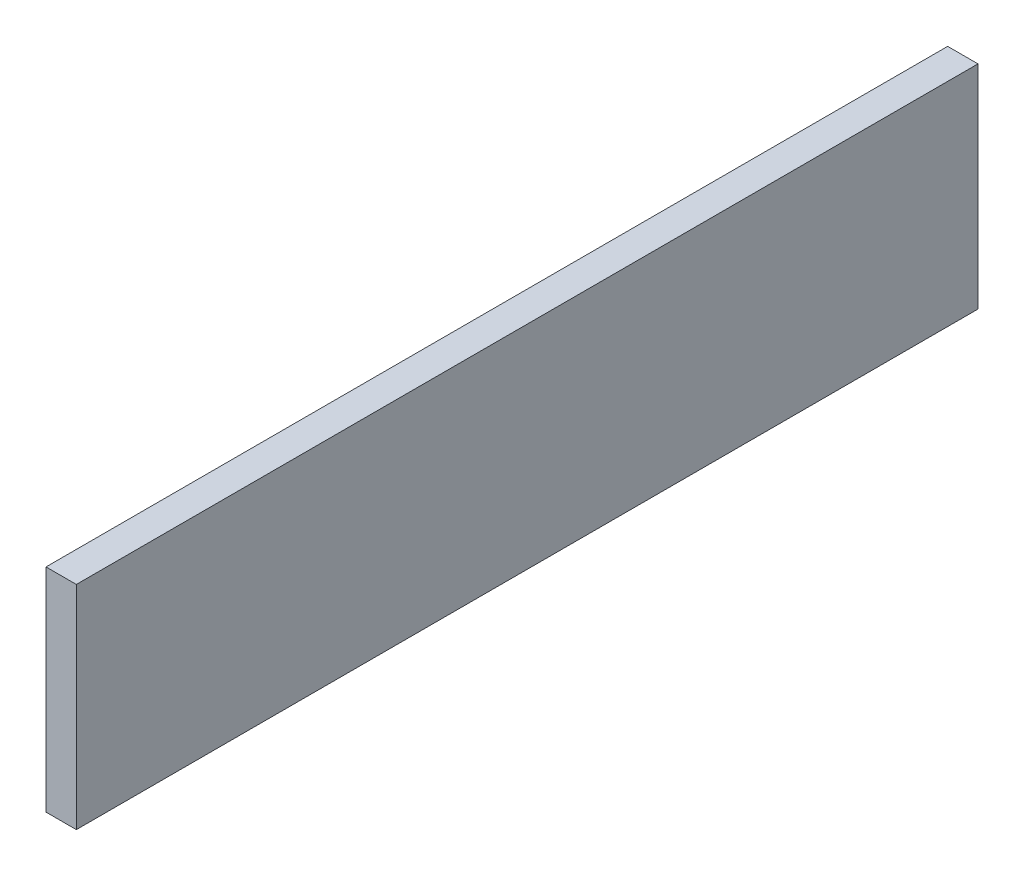
ISO-10303-21;
HEADER;
FILE_DESCRIPTION(('STEP AP214'),'2;1');
FILE_NAME('part.step','',(''),(''),'','','');
FILE_SCHEMA(('AUTOMOTIVE_DESIGN { 1 0 10303 214 1 1 1 1 }'));
ENDSEC;
DATA;
#1=APPLICATION_CONTEXT('core data for automotive mechanical design processes');
#2=APPLICATION_PROTOCOL_DEFINITION('international standard','automotive_design',2000,#1);
#3=PRODUCT_CONTEXT('',#1,'mechanical');
#4=PRODUCT('Part','Part','',(#3));
#5=PRODUCT_RELATED_PRODUCT_CATEGORY('part','',(#4));
#6=PRODUCT_DEFINITION_FORMATION('','',#4);
#7=PRODUCT_DEFINITION_CONTEXT('part definition',#1,'design');
#8=PRODUCT_DEFINITION('design','',#6,#7);
#9=PRODUCT_DEFINITION_SHAPE('','',#8);
#10=(LENGTH_UNIT() NAMED_UNIT(*) SI_UNIT(.MILLI.,.METRE.));
#11=(NAMED_UNIT(*) PLANE_ANGLE_UNIT() SI_UNIT($,.RADIAN.));
#12=(NAMED_UNIT(*) SI_UNIT($,.STERADIAN.) SOLID_ANGLE_UNIT());
#13=UNCERTAINTY_MEASURE_WITH_UNIT(LENGTH_MEASURE(1.E-05),#10,'distance_accuracy_value','');
#14=(GEOMETRIC_REPRESENTATION_CONTEXT(3) GLOBAL_UNCERTAINTY_ASSIGNED_CONTEXT((#13)) GLOBAL_UNIT_ASSIGNED_CONTEXT((#10,
#11,#12)) REPRESENTATION_CONTEXT('',''));
#15=CARTESIAN_POINT('',(0.,0.,0.));
#16=DIRECTION('',(0.,0.,1.));
#17=DIRECTION('',(1.,0.,0.));
#18=AXIS2_PLACEMENT_3D('',#15,#16,#17);
#19=CARTESIAN_POINT('',(-2.,-14.,-59.44));
#20=DIRECTION('',(-1.,0.,0.));
#21=DIRECTION('',(0.,-1.,0.));
#22=AXIS2_PLACEMENT_3D('',#19,#20,#21);
#23=PLANE('',#22);
#24=DIRECTION('',(0.,0.,1.));
#25=VECTOR('',#24,1.);
#26=CARTESIAN_POINT('',(-2.,-14.,-59.44));
#27=LINE('',#26,#25);
#28=CARTESIAN_POINT('',(-2.,-14.,-59.44));
#29=VERTEX_POINT('',#28);
#30=CARTESIAN_POINT('',(-2.,-14.,59.44));
#31=VERTEX_POINT('',#30);
#32=EDGE_CURVE('E35',#29,#31,#27,.T.);
#33=ORIENTED_EDGE('',*,*,#32,.T.);
#34=DIRECTION('',(0.,-1.,0.));
#35=VECTOR('',#34,1.);
#36=CARTESIAN_POINT('',(-2.,-14.,59.44));
#37=LINE('',#36,#35);
#38=CARTESIAN_POINT('',(-2.,14.,59.44));
#39=VERTEX_POINT('',#38);
#40=EDGE_CURVE('E72',#39,#31,#37,.T.);
#41=ORIENTED_EDGE('',*,*,#40,.F.);
#42=DIRECTION('',(0.,0.,1.));
#43=VECTOR('',#42,1.);
#44=CARTESIAN_POINT('',(-2.,14.,-59.44));
#45=LINE('',#44,#43);
#46=CARTESIAN_POINT('',(-2.,14.,-59.44));
#47=VERTEX_POINT('',#46);
#48=EDGE_CURVE('E11',#47,#39,#45,.T.);
#49=ORIENTED_EDGE('',*,*,#48,.F.);
#50=DIRECTION('',(0.,-1.,0.));
#51=VECTOR('',#50,1.);
#52=CARTESIAN_POINT('',(-2.,-14.,-59.44));
#53=LINE('',#52,#51);
#54=EDGE_CURVE('E73',#47,#29,#53,.T.);
#55=ORIENTED_EDGE('',*,*,#54,.T.);
#56=EDGE_LOOP('',(#33,#41,#49,#55));
#57=FACE_BOUND('',#56,.T.);
#58=ADVANCED_FACE('F32',(#57),#23,.T.);
#59=CARTESIAN_POINT('',(-2.,14.,-59.44));
#60=DIRECTION('',(0.,1.,0.));
#61=DIRECTION('',(0.,0.,1.));
#62=AXIS2_PLACEMENT_3D('',#59,#60,#61);
#63=PLANE('',#62);
#64=ORIENTED_EDGE('',*,*,#48,.T.);
#65=DIRECTION('',(-1.,0.,0.));
#66=VECTOR('',#65,1.);
#67=CARTESIAN_POINT('',(-2.,14.,59.44));
#68=LINE('',#67,#66);
#69=CARTESIAN_POINT('',(2.,14.,59.44));
#70=VERTEX_POINT('',#69);
#71=EDGE_CURVE('E89',#70,#39,#68,.T.);
#72=ORIENTED_EDGE('',*,*,#71,.F.);
#73=DIRECTION('',(0.,0.,1.));
#74=VECTOR('',#73,1.);
#75=CARTESIAN_POINT('',(2.,14.,-59.44));
#76=LINE('',#75,#74);
#77=CARTESIAN_POINT('',(2.,14.,-59.44));
#78=VERTEX_POINT('',#77);
#79=EDGE_CURVE('E40',#78,#70,#76,.T.);
#80=ORIENTED_EDGE('',*,*,#79,.F.);
#81=DIRECTION('',(-1.,0.,0.));
#82=VECTOR('',#81,1.);
#83=CARTESIAN_POINT('',(-2.,14.,-59.44));
#84=LINE('',#83,#82);
#85=EDGE_CURVE('E78',#78,#47,#84,.T.);
#86=ORIENTED_EDGE('',*,*,#85,.T.);
#87=EDGE_LOOP('',(#64,#72,#80,#86));
#88=FACE_BOUND('',#87,.T.);
#89=ADVANCED_FACE('F104',(#88),#63,.T.);
#90=CARTESIAN_POINT('',(2.,-14.,-59.44));
#91=DIRECTION('',(1.,0.,0.));
#92=DIRECTION('',(0.,1.,0.));
#93=AXIS2_PLACEMENT_3D('',#90,#91,#92);
#94=PLANE('',#93);
#95=ORIENTED_EDGE('',*,*,#79,.T.);
#96=DIRECTION('',(0.,1.,0.));
#97=VECTOR('',#96,1.);
#98=CARTESIAN_POINT('',(2.,-14.,59.44));
#99=LINE('',#98,#97);
#100=CARTESIAN_POINT('',(2.,-14.,59.44));
#101=VERTEX_POINT('',#100);
#102=EDGE_CURVE('E85',#101,#70,#99,.T.);
#103=ORIENTED_EDGE('',*,*,#102,.F.);
#104=DIRECTION('',(0.,0.,1.));
#105=VECTOR('',#104,1.);
#106=CARTESIAN_POINT('',(2.,-14.,-59.44));
#107=LINE('',#106,#105);
#108=CARTESIAN_POINT('',(2.,-14.,-59.44));
#109=VERTEX_POINT('',#108);
#110=EDGE_CURVE('E77',#109,#101,#107,.T.);
#111=ORIENTED_EDGE('',*,*,#110,.F.);
#112=DIRECTION('',(0.,1.,0.));
#113=VECTOR('',#112,1.);
#114=CARTESIAN_POINT('',(2.,-14.,-59.44));
#115=LINE('',#114,#113);
#116=EDGE_CURVE('E97',#109,#78,#115,.T.);
#117=ORIENTED_EDGE('',*,*,#116,.T.);
#118=EDGE_LOOP('',(#95,#103,#111,#117));
#119=FACE_BOUND('',#118,.T.);
#120=ADVANCED_FACE('F101',(#119),#94,.T.);
#121=CARTESIAN_POINT('',(-2.,-14.,-59.44));
#122=DIRECTION('',(0.,-1.,0.));
#123=DIRECTION('',(0.,0.,-1.));
#124=AXIS2_PLACEMENT_3D('',#121,#122,#123);
#125=PLANE('',#124);
#126=ORIENTED_EDGE('',*,*,#110,.T.);
#127=DIRECTION('',(1.,0.,0.));
#128=VECTOR('',#127,1.);
#129=CARTESIAN_POINT('',(-2.,-14.,59.44));
#130=LINE('',#129,#128);
#131=EDGE_CURVE('E80',#31,#101,#130,.T.);
#132=ORIENTED_EDGE('',*,*,#131,.F.);
#133=ORIENTED_EDGE('',*,*,#32,.F.);
#134=DIRECTION('',(1.,0.,0.));
#135=VECTOR('',#134,1.);
#136=CARTESIAN_POINT('',(-2.,-14.,-59.44));
#137=LINE('',#136,#135);
#138=EDGE_CURVE('E95',#29,#109,#137,.T.);
#139=ORIENTED_EDGE('',*,*,#138,.T.);
#140=EDGE_LOOP('',(#126,#132,#133,#139));
#141=FACE_BOUND('',#140,.T.);
#142=ADVANCED_FACE('F81',(#141),#125,.T.);
#143=CARTESIAN_POINT('',(0.,0.,-59.44));
#144=DIRECTION('',(0.,0.,-1.));
#145=DIRECTION('',(-1.,0.,0.));
#146=AXIS2_PLACEMENT_3D('',#143,#144,#145);
#147=PLANE('',#146);
#148=ORIENTED_EDGE('',*,*,#54,.F.);
#149=ORIENTED_EDGE('',*,*,#85,.F.);
#150=ORIENTED_EDGE('',*,*,#116,.F.);
#151=ORIENTED_EDGE('',*,*,#138,.F.);
#152=EDGE_LOOP('',(#148,#149,#150,#151));
#153=FACE_BOUND('',#152,.T.);
#154=ADVANCED_FACE('F106',(#153),#147,.T.);
#155=CARTESIAN_POINT('',(0.,0.,59.44));
#156=DIRECTION('',(0.,0.,-1.));
#157=DIRECTION('',(-1.,0.,0.));
#158=AXIS2_PLACEMENT_3D('',#155,#156,#157);
#159=PLANE('',#158);
#160=ORIENTED_EDGE('',*,*,#40,.T.);
#161=ORIENTED_EDGE('',*,*,#131,.T.);
#162=ORIENTED_EDGE('',*,*,#102,.T.);
#163=ORIENTED_EDGE('',*,*,#71,.T.);
#164=EDGE_LOOP('',(#160,#161,#162,#163));
#165=FACE_BOUND('',#164,.T.);
#166=ADVANCED_FACE('F88',(#165),#159,.F.);
#167=CLOSED_SHELL('',(#58,#89,#120,#142,#154,#166));
#168=MANIFOLD_SOLID_BREP('B2',#167);
#169=ADVANCED_BREP_SHAPE_REPRESENTATION('',(#18,#168),#14);
#170=SHAPE_DEFINITION_REPRESENTATION(#9,#169);
ENDSEC;
END-ISO-10303-21;
